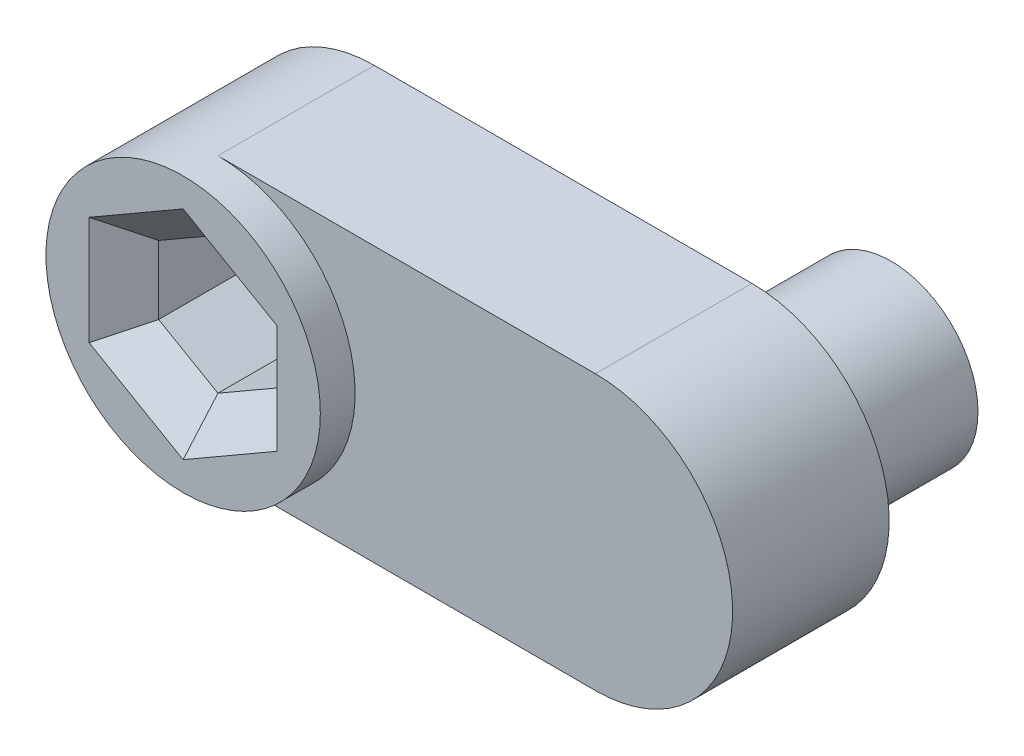
ISO-10303-21;
HEADER;
FILE_DESCRIPTION(('STEP AP214'),'2;1');
FILE_NAME('part.step','',(''),(''),'','','');
FILE_SCHEMA(('AUTOMOTIVE_DESIGN { 1 0 10303 214 1 1 1 1 }'));
ENDSEC;
DATA;
#1=APPLICATION_CONTEXT('core data for automotive mechanical design processes');
#2=APPLICATION_PROTOCOL_DEFINITION('international standard','automotive_design',2000,#1);
#3=PRODUCT_CONTEXT('',#1,'mechanical');
#4=PRODUCT('Part','Part','',(#3));
#5=PRODUCT_RELATED_PRODUCT_CATEGORY('part','',(#4));
#6=PRODUCT_DEFINITION_FORMATION('','',#4);
#7=PRODUCT_DEFINITION_CONTEXT('part definition',#1,'design');
#8=PRODUCT_DEFINITION('design','',#6,#7);
#9=PRODUCT_DEFINITION_SHAPE('','',#8);
#10=(LENGTH_UNIT() NAMED_UNIT(*) SI_UNIT(.MILLI.,.METRE.));
#11=(NAMED_UNIT(*) PLANE_ANGLE_UNIT() SI_UNIT($,.RADIAN.));
#12=(NAMED_UNIT(*) SI_UNIT($,.STERADIAN.) SOLID_ANGLE_UNIT());
#13=UNCERTAINTY_MEASURE_WITH_UNIT(LENGTH_MEASURE(1.E-05),#10,'distance_accuracy_value','');
#14=(GEOMETRIC_REPRESENTATION_CONTEXT(3) GLOBAL_UNCERTAINTY_ASSIGNED_CONTEXT((#13)) GLOBAL_UNIT_ASSIGNED_CONTEXT((#10,
#11,#12)) REPRESENTATION_CONTEXT('',''));
#15=CARTESIAN_POINT('',(0.,0.,0.));
#16=DIRECTION('',(0.,0.,1.));
#17=DIRECTION('',(1.,0.,0.));
#18=AXIS2_PLACEMENT_3D('',#15,#16,#17);
#19=CARTESIAN_POINT('',(-7.44719003610826,-1.96749999999999,-8.));
#20=DIRECTION('',(1.,0.,0.));
#21=DIRECTION('',(0.,1.,0.));
#22=AXIS2_PLACEMENT_3D('',#19,#20,#21);
#23=PLANE('',#22);
#24=DIRECTION('',(0.,0.,1.));
#25=VECTOR('',#24,1.);
#26=CARTESIAN_POINT('',(-7.44719003610826,-1.96749999999999,-8.));
#27=LINE('',#26,#25);
#28=CARTESIAN_POINT('',(-7.44719003610826,-1.96749999999999,2.));
#29=VERTEX_POINT('',#28);
#30=CARTESIAN_POINT('',(-7.44719003610826,-1.96749999999999,8.99999999999999));
#31=VERTEX_POINT('',#30);
#32=EDGE_CURVE('E274',#29,#31,#27,.T.);
#33=ORIENTED_EDGE('',*,*,#32,.T.);
#34=DIRECTION('',(0.,1.,0.));
#35=VECTOR('',#34,1.);
#36=CARTESIAN_POINT('',(-7.44719003610826,1.96749999999998,8.99999999999999));
#37=LINE('',#36,#35);
#38=CARTESIAN_POINT('',(-7.44719003610826,1.96749999999998,8.99999999999999));
#39=VERTEX_POINT('',#38);
#40=EDGE_CURVE('E55',#31,#39,#37,.T.);
#41=ORIENTED_EDGE('',*,*,#40,.T.);
#42=DIRECTION('',(0.,0.,1.));
#43=VECTOR('',#42,1.);
#44=CARTESIAN_POINT('',(-7.44719003610826,1.96749999999998,-8.));
#45=LINE('',#44,#43);
#46=CARTESIAN_POINT('',(-7.44719003610826,1.96749999999998,2.));
#47=VERTEX_POINT('',#46);
#48=EDGE_CURVE('E273',#47,#39,#45,.T.);
#49=ORIENTED_EDGE('',*,*,#48,.F.);
#50=DIRECTION('',(0.,1.,0.));
#51=VECTOR('',#50,1.);
#52=CARTESIAN_POINT('',(-7.44719003610826,-1.96749999999999,2.));
#53=LINE('',#52,#51);
#54=EDGE_CURVE('E271',#29,#47,#53,.T.);
#55=ORIENTED_EDGE('',*,*,#54,.F.);
#56=EDGE_LOOP('',(#33,#41,#49,#55));
#57=FACE_BOUND('',#56,.T.);
#58=ADVANCED_FACE('F45',(#57),#23,.F.);
#59=CARTESIAN_POINT('',(-10.855,-3.93499999999998,-8.));
#60=DIRECTION('',(0.5,-0.866025403784439,0.));
#61=DIRECTION('',(0.866025403784439,0.5,0.));
#62=AXIS2_PLACEMENT_3D('',#59,#60,#61);
#63=PLANE('',#62);
#64=DIRECTION('',(0.,0.,1.));
#65=VECTOR('',#64,1.);
#66=CARTESIAN_POINT('',(-10.855,-3.93499999999998,-8.));
#67=LINE('',#66,#65);
#68=CARTESIAN_POINT('',(-10.855,-3.93499999999998,2.));
#69=VERTEX_POINT('',#68);
#70=CARTESIAN_POINT('',(-10.855,-3.93499999999998,8.99999999999999));
#71=VERTEX_POINT('',#70);
#72=EDGE_CURVE('E277',#69,#71,#67,.T.);
#73=ORIENTED_EDGE('',*,*,#72,.T.);
#74=DIRECTION('',(0.866025403784439,0.5,0.));
#75=VECTOR('',#74,1.);
#76=CARTESIAN_POINT('',(-7.44719003610826,-1.96749999999999,8.99999999999999));
#77=LINE('',#76,#75);
#78=EDGE_CURVE('E70',#71,#31,#77,.T.);
#79=ORIENTED_EDGE('',*,*,#78,.T.);
#80=ORIENTED_EDGE('',*,*,#32,.F.);
#81=DIRECTION('',(0.866025403784439,0.5,0.));
#82=VECTOR('',#81,1.);
#83=CARTESIAN_POINT('',(-10.855,-3.93499999999998,2.));
#84=LINE('',#83,#82);
#85=EDGE_CURVE('E269',#69,#29,#84,.T.);
#86=ORIENTED_EDGE('',*,*,#85,.F.);
#87=EDGE_LOOP('',(#73,#79,#80,#86));
#88=FACE_BOUND('',#87,.T.);
#89=ADVANCED_FACE('F363',(#88),#63,.F.);
#90=CARTESIAN_POINT('',(-14.2628099638917,-1.96749999999999,-8.));
#91=DIRECTION('',(-0.5,-0.866025403784439,0.));
#92=DIRECTION('',(0.866025403784439,-0.5,0.));
#93=AXIS2_PLACEMENT_3D('',#90,#91,#92);
#94=PLANE('',#93);
#95=DIRECTION('',(0.,0.,1.));
#96=VECTOR('',#95,1.);
#97=CARTESIAN_POINT('',(-14.2628099638917,-1.96749999999999,-8.));
#98=LINE('',#97,#96);
#99=CARTESIAN_POINT('',(-14.2628099638917,-1.96749999999999,2.));
#100=VERTEX_POINT('',#99);
#101=CARTESIAN_POINT('',(-14.2628099638917,-1.96749999999999,8.99999999999999));
#102=VERTEX_POINT('',#101);
#103=EDGE_CURVE('E279',#100,#102,#98,.T.);
#104=ORIENTED_EDGE('',*,*,#103,.T.);
#105=DIRECTION('',(0.866025403784439,-0.5,0.));
#106=VECTOR('',#105,1.);
#107=CARTESIAN_POINT('',(-10.855,-3.93499999999998,8.99999999999998));
#108=LINE('',#107,#106);
#109=EDGE_CURVE('E323',#102,#71,#108,.T.);
#110=ORIENTED_EDGE('',*,*,#109,.T.);
#111=ORIENTED_EDGE('',*,*,#72,.F.);
#112=DIRECTION('',(0.866025403784439,-0.5,0.));
#113=VECTOR('',#112,1.);
#114=CARTESIAN_POINT('',(-14.2628099638917,-1.96749999999999,2.));
#115=LINE('',#114,#113);
#116=EDGE_CURVE('E267',#100,#69,#115,.T.);
#117=ORIENTED_EDGE('',*,*,#116,.F.);
#118=EDGE_LOOP('',(#104,#110,#111,#117));
#119=FACE_BOUND('',#118,.T.);
#120=ADVANCED_FACE('F369',(#119),#94,.F.);
#121=CARTESIAN_POINT('',(-14.2628099638917,1.96749999999998,-8.));
#122=DIRECTION('',(-1.,0.,0.));
#123=DIRECTION('',(0.,-1.,0.));
#124=AXIS2_PLACEMENT_3D('',#121,#122,#123);
#125=PLANE('',#124);
#126=DIRECTION('',(0.,0.,1.));
#127=VECTOR('',#126,1.);
#128=CARTESIAN_POINT('',(-14.2628099638917,1.96749999999998,-8.));
#129=LINE('',#128,#127);
#130=CARTESIAN_POINT('',(-14.2628099638917,1.96749999999998,2.));
#131=VERTEX_POINT('',#130);
#132=CARTESIAN_POINT('',(-14.2628099638917,1.96749999999998,8.99999999999999));
#133=VERTEX_POINT('',#132);
#134=EDGE_CURVE('E282',#131,#133,#129,.T.);
#135=ORIENTED_EDGE('',*,*,#134,.T.);
#136=DIRECTION('',(0.,-1.,0.));
#137=VECTOR('',#136,1.);
#138=CARTESIAN_POINT('',(-14.2628099638917,-1.96749999999999,8.99999999999999));
#139=LINE('',#138,#137);
#140=EDGE_CURVE('E321',#133,#102,#139,.T.);
#141=ORIENTED_EDGE('',*,*,#140,.T.);
#142=ORIENTED_EDGE('',*,*,#103,.F.);
#143=DIRECTION('',(0.,-1.,0.));
#144=VECTOR('',#143,1.);
#145=CARTESIAN_POINT('',(-14.2628099638917,1.96749999999998,2.));
#146=LINE('',#145,#144);
#147=EDGE_CURVE('E265',#131,#100,#146,.T.);
#148=ORIENTED_EDGE('',*,*,#147,.F.);
#149=EDGE_LOOP('',(#135,#141,#142,#148));
#150=FACE_BOUND('',#149,.T.);
#151=ADVANCED_FACE('F468',(#150),#125,.F.);
#152=CARTESIAN_POINT('',(-10.855,3.93499999999997,-8.));
#153=DIRECTION('',(-0.5,0.866025403784439,0.));
#154=DIRECTION('',(-0.866025403784439,-0.5,0.));
#155=AXIS2_PLACEMENT_3D('',#152,#153,#154);
#156=PLANE('',#155);
#157=DIRECTION('',(0.,0.,1.));
#158=VECTOR('',#157,1.);
#159=CARTESIAN_POINT('',(-10.855,3.93499999999997,-8.));
#160=LINE('',#159,#158);
#161=CARTESIAN_POINT('',(-10.855,3.93499999999997,2.));
#162=VERTEX_POINT('',#161);
#163=CARTESIAN_POINT('',(-10.855,3.93499999999997,8.99999999999999));
#164=VERTEX_POINT('',#163);
#165=EDGE_CURVE('E285',#162,#164,#160,.T.);
#166=ORIENTED_EDGE('',*,*,#165,.T.);
#167=DIRECTION('',(-0.866025403784439,-0.5,0.));
#168=VECTOR('',#167,1.);
#169=CARTESIAN_POINT('',(-14.2628099638917,1.96749999999998,8.99999999999999));
#170=LINE('',#169,#168);
#171=EDGE_CURVE('E318',#164,#133,#170,.T.);
#172=ORIENTED_EDGE('',*,*,#171,.T.);
#173=ORIENTED_EDGE('',*,*,#134,.F.);
#174=DIRECTION('',(-0.866025403784439,-0.5,0.));
#175=VECTOR('',#174,1.);
#176=CARTESIAN_POINT('',(-10.855,3.93499999999997,2.));
#177=LINE('',#176,#175);
#178=EDGE_CURVE('E253',#162,#131,#177,.T.);
#179=ORIENTED_EDGE('',*,*,#178,.F.);
#180=EDGE_LOOP('',(#166,#172,#173,#179));
#181=FACE_BOUND('',#180,.T.);
#182=ADVANCED_FACE('F406',(#181),#156,.F.);
#183=CARTESIAN_POINT('',(-7.44719003610826,1.96749999999998,-8.));
#184=DIRECTION('',(0.5,0.866025403784439,0.));
#185=DIRECTION('',(-0.866025403784439,0.5,0.));
#186=AXIS2_PLACEMENT_3D('',#183,#184,#185);
#187=PLANE('',#186);
#188=ORIENTED_EDGE('',*,*,#48,.T.);
#189=DIRECTION('',(-0.866025403784439,0.5,0.));
#190=VECTOR('',#189,1.);
#191=CARTESIAN_POINT('',(-10.855,3.93499999999997,8.99999999999999));
#192=LINE('',#191,#190);
#193=EDGE_CURVE('E11',#39,#164,#192,.T.);
#194=ORIENTED_EDGE('',*,*,#193,.T.);
#195=ORIENTED_EDGE('',*,*,#165,.F.);
#196=DIRECTION('',(-0.866025403784439,0.5,0.));
#197=VECTOR('',#196,1.);
#198=CARTESIAN_POINT('',(-7.44719003610826,1.96749999999998,2.));
#199=LINE('',#198,#197);
#200=EDGE_CURVE('E206',#47,#162,#199,.T.);
#201=ORIENTED_EDGE('',*,*,#200,.F.);
#202=EDGE_LOOP('',(#188,#194,#195,#201));
#203=FACE_BOUND('',#202,.T.);
#204=ADVANCED_FACE('F373',(#203),#187,.F.);
#205=CARTESIAN_POINT('',(10.855,0.,9.));
#206=DIRECTION('',(0.,0.,-1.));
#207=DIRECTION('',(-1.,0.,0.));
#208=AXIS2_PLACEMENT_3D('',#205,#206,#207);
#209=CYLINDRICAL_SURFACE('',#208,7.89);
#210=CARTESIAN_POINT('',(10.855,0.,0.));
#211=DIRECTION('',(0.,0.,1.));
#212=DIRECTION('',(1.,0.,0.));
#213=AXIS2_PLACEMENT_3D('',#210,#211,#212);
#214=CIRCLE('',#213,7.89);
#215=CARTESIAN_POINT('',(10.855,-7.89,0.));
#216=VERTEX_POINT('',#215);
#217=CARTESIAN_POINT('',(10.855,7.89,0.));
#218=VERTEX_POINT('',#217);
#219=EDGE_CURVE('E291',#216,#218,#214,.T.);
#220=ORIENTED_EDGE('',*,*,#219,.T.);
#221=DIRECTION('',(0.,0.,-1.));
#222=VECTOR('',#221,1.);
#223=CARTESIAN_POINT('',(10.855,7.89,9.));
#224=LINE('',#223,#222);
#225=CARTESIAN_POINT('',(10.855,7.89,9.));
#226=VERTEX_POINT('',#225);
#227=EDGE_CURVE('E189',#226,#218,#224,.T.);
#228=ORIENTED_EDGE('',*,*,#227,.F.);
#229=CARTESIAN_POINT('',(10.855,0.,9.));
#230=DIRECTION('',(0.,0.,1.));
#231=DIRECTION('',(1.,0.,0.));
#232=AXIS2_PLACEMENT_3D('',#229,#230,#231);
#233=CIRCLE('',#232,7.89);
#234=CARTESIAN_POINT('',(10.855,-7.89,9.));
#235=VERTEX_POINT('',#234);
#236=EDGE_CURVE('E197',#235,#226,#233,.T.);
#237=ORIENTED_EDGE('',*,*,#236,.F.);
#238=DIRECTION('',(0.,0.,-1.));
#239=VECTOR('',#238,1.);
#240=CARTESIAN_POINT('',(10.855,-7.89,9.));
#241=LINE('',#240,#239);
#242=EDGE_CURVE('E295',#235,#216,#241,.T.);
#243=ORIENTED_EDGE('',*,*,#242,.T.);
#244=EDGE_LOOP('',(#220,#228,#237,#243));
#245=FACE_BOUND('',#244,.T.);
#246=ADVANCED_FACE('F360',(#245),#209,.T.);
#247=CARTESIAN_POINT('',(10.855,7.89,9.));
#248=DIRECTION('',(0.,-1.,0.));
#249=DIRECTION('',(1.,0.,0.));
#250=AXIS2_PLACEMENT_3D('',#247,#248,#249);
#251=PLANE('',#250);
#252=DIRECTION('',(-1.,0.,0.));
#253=VECTOR('',#252,1.);
#254=CARTESIAN_POINT('',(10.855,7.89,0.));
#255=LINE('',#254,#253);
#256=CARTESIAN_POINT('',(-10.855,7.89,0.));
#257=VERTEX_POINT('',#256);
#258=EDGE_CURVE('E185',#218,#257,#255,.T.);
#259=ORIENTED_EDGE('',*,*,#258,.T.);
#260=DIRECTION('',(0.,0.,-1.));
#261=VECTOR('',#260,1.);
#262=CARTESIAN_POINT('',(-10.855,7.89,9.));
#263=LINE('',#262,#261);
#264=CARTESIAN_POINT('',(-10.855,7.89,9.));
#265=VERTEX_POINT('',#264);
#266=EDGE_CURVE('E179',#265,#257,#263,.T.);
#267=ORIENTED_EDGE('',*,*,#266,.F.);
#268=DIRECTION('',(-1.,0.,0.));
#269=VECTOR('',#268,1.);
#270=CARTESIAN_POINT('',(10.855,7.89,9.));
#271=LINE('',#270,#269);
#272=EDGE_CURVE('E183',#226,#265,#271,.T.);
#273=ORIENTED_EDGE('',*,*,#272,.F.);
#274=ORIENTED_EDGE('',*,*,#227,.T.);
#275=EDGE_LOOP('',(#259,#267,#273,#274));
#276=FACE_BOUND('',#275,.T.);
#277=ADVANCED_FACE('F181',(#276),#251,.F.);
#278=CARTESIAN_POINT('',(-10.855,0.,9.));
#279=DIRECTION('',(0.,0.,-1.));
#280=DIRECTION('',(-1.,0.,0.));
#281=AXIS2_PLACEMENT_3D('',#278,#279,#280);
#282=CYLINDRICAL_SURFACE('',#281,7.89);
#283=CARTESIAN_POINT('',(-10.855,0.,0.));
#284=DIRECTION('',(0.,0.,1.));
#285=DIRECTION('',(1.,0.,0.));
#286=AXIS2_PLACEMENT_3D('',#283,#284,#285);
#287=CIRCLE('',#286,7.89);
#288=CARTESIAN_POINT('',(-10.855,-7.89,0.));
#289=VERTEX_POINT('',#288);
#290=EDGE_CURVE('E299',#257,#289,#287,.T.);
#291=ORIENTED_EDGE('',*,*,#290,.T.);
#292=DIRECTION('',(0.,0.,-1.));
#293=VECTOR('',#292,1.);
#294=CARTESIAN_POINT('',(-10.855,-7.89,9.));
#295=LINE('',#294,#293);
#296=CARTESIAN_POINT('',(-10.855,-7.89,9.));
#297=VERTEX_POINT('',#296);
#298=EDGE_CURVE('E190',#297,#289,#295,.T.);
#299=ORIENTED_EDGE('',*,*,#298,.F.);
#300=CARTESIAN_POINT('',(-10.855,0.,9.));
#301=DIRECTION('',(0.,0.,1.));
#302=DIRECTION('',(1.,0.,0.));
#303=AXIS2_PLACEMENT_3D('',#300,#301,#302);
#304=CIRCLE('',#303,7.89);
#305=EDGE_CURVE('E194',#297,#265,#304,.T.);
#306=ORIENTED_EDGE('',*,*,#305,.T.);
#307=ORIENTED_EDGE('',*,*,#266,.T.);
#308=EDGE_LOOP('',(#291,#299,#306,#307));
#309=FACE_BOUND('',#308,.T.);
#310=CARTESIAN_POINT('',(-10.855,0.,11.));
#311=DIRECTION('',(0.,0.,1.));
#312=DIRECTION('',(1.,0.,0.));
#313=AXIS2_PLACEMENT_3D('',#310,#311,#312);
#314=CIRCLE('',#313,7.89);
#315=CARTESIAN_POINT('',(-2.965,0.,11.));
#316=VERTEX_POINT('',#315);
#317=EDGE_CURVE('E214',#316,#316,#314,.T.);
#318=ORIENTED_EDGE('',*,*,#317,.F.);
#319=EDGE_LOOP('',(#318));
#320=FACE_BOUND('',#319,.T.);
#321=ADVANCED_FACE('F201',(#309,#320),#282,.T.);
#322=CARTESIAN_POINT('',(10.855,-7.89,9.));
#323=DIRECTION('',(0.,1.,0.));
#324=DIRECTION('',(-1.,0.,0.));
#325=AXIS2_PLACEMENT_3D('',#322,#323,#324);
#326=PLANE('',#325);
#327=DIRECTION('',(1.,0.,0.));
#328=VECTOR('',#327,1.);
#329=CARTESIAN_POINT('',(10.855,-7.89,0.));
#330=LINE('',#329,#328);
#331=EDGE_CURVE('E292',#289,#216,#330,.T.);
#332=ORIENTED_EDGE('',*,*,#331,.T.);
#333=ORIENTED_EDGE('',*,*,#242,.F.);
#334=DIRECTION('',(1.,0.,0.));
#335=VECTOR('',#334,1.);
#336=CARTESIAN_POINT('',(10.855,-7.89,9.));
#337=LINE('',#336,#335);
#338=EDGE_CURVE('E199',#297,#235,#337,.T.);
#339=ORIENTED_EDGE('',*,*,#338,.F.);
#340=ORIENTED_EDGE('',*,*,#298,.T.);
#341=EDGE_LOOP('',(#332,#333,#339,#340));
#342=FACE_BOUND('',#341,.T.);
#343=ADVANCED_FACE('F351',(#342),#326,.F.);
#344=CARTESIAN_POINT('',(10.855,0.,9.));
#345=DIRECTION('',(0.,0.,1.));
#346=DIRECTION('',(1.,0.,0.));
#347=AXIS2_PLACEMENT_3D('',#344,#345,#346);
#348=PLANE('',#347);
#349=ORIENTED_EDGE('',*,*,#305,.F.);
#350=ORIENTED_EDGE('',*,*,#338,.T.);
#351=ORIENTED_EDGE('',*,*,#236,.T.);
#352=ORIENTED_EDGE('',*,*,#272,.T.);
#353=EDGE_LOOP('',(#349,#350,#351,#352));
#354=FACE_BOUND('',#353,.T.);
#355=ADVANCED_FACE('F193',(#354),#348,.T.);
#356=CARTESIAN_POINT('',(10.855,0.,0.));
#357=DIRECTION('',(0.,0.,1.));
#358=DIRECTION('',(1.,0.,0.));
#359=AXIS2_PLACEMENT_3D('',#356,#357,#358);
#360=PLANE('',#359);
#361=DIRECTION('',(0.,-1.,0.));
#362=VECTOR('',#361,1.);
#363=CARTESIAN_POINT('',(-5.44719003610826,3.12220053837923,0.));
#364=LINE('',#363,#362);
#365=CARTESIAN_POINT('',(-5.44719003610826,3.12220053837923,0.));
#366=VERTEX_POINT('',#365);
#367=CARTESIAN_POINT('',(-5.44719003610826,-3.12220053837924,0.));
#368=VERTEX_POINT('',#367);
#369=EDGE_CURVE('E237',#366,#368,#364,.T.);
#370=ORIENTED_EDGE('',*,*,#369,.F.);
#371=DIRECTION('',(0.866025403784439,-0.5,0.));
#372=VECTOR('',#371,1.);
#373=CARTESIAN_POINT('',(-10.855,6.24440107675847,0.));
#374=LINE('',#373,#372);
#375=CARTESIAN_POINT('',(-10.855,6.24440107675847,0.));
#376=VERTEX_POINT('',#375);
#377=EDGE_CURVE('E235',#376,#366,#374,.T.);
#378=ORIENTED_EDGE('',*,*,#377,.F.);
#379=DIRECTION('',(0.866025403784439,0.5,0.));
#380=VECTOR('',#379,1.);
#381=CARTESIAN_POINT('',(-16.2628099638917,3.12220053837923,0.));
#382=LINE('',#381,#380);
#383=CARTESIAN_POINT('',(-16.2628099638917,3.12220053837923,0.));
#384=VERTEX_POINT('',#383);
#385=EDGE_CURVE('E219',#384,#376,#382,.T.);
#386=ORIENTED_EDGE('',*,*,#385,.F.);
#387=DIRECTION('',(0.,1.,0.));
#388=VECTOR('',#387,1.);
#389=CARTESIAN_POINT('',(-16.2628099638917,-3.12220053837924,0.));
#390=LINE('',#389,#388);
#391=CARTESIAN_POINT('',(-16.2628099638917,-3.12220053837924,0.));
#392=VERTEX_POINT('',#391);
#393=EDGE_CURVE('E246',#392,#384,#390,.T.);
#394=ORIENTED_EDGE('',*,*,#393,.F.);
#395=DIRECTION('',(-0.866025403784439,0.5,0.));
#396=VECTOR('',#395,1.);
#397=CARTESIAN_POINT('',(-10.855,-6.24440107675848,0.));
#398=LINE('',#397,#396);
#399=CARTESIAN_POINT('',(-10.855,-6.24440107675848,0.));
#400=VERTEX_POINT('',#399);
#401=EDGE_CURVE('E243',#400,#392,#398,.T.);
#402=ORIENTED_EDGE('',*,*,#401,.F.);
#403=DIRECTION('',(-0.866025403784438,-0.5,0.));
#404=VECTOR('',#403,1.);
#405=CARTESIAN_POINT('',(-5.44719003610826,-3.12220053837924,0.));
#406=LINE('',#405,#404);
#407=EDGE_CURVE('E240',#368,#400,#406,.T.);
#408=ORIENTED_EDGE('',*,*,#407,.F.);
#409=EDGE_LOOP('',(#370,#378,#386,#394,#402,#408));
#410=FACE_BOUND('',#409,.T.);
#411=CARTESIAN_POINT('',(10.855,0.,0.));
#412=DIRECTION('',(0.,0.,1.));
#413=DIRECTION('',(1.,0.,0.));
#414=AXIS2_PLACEMENT_3D('',#411,#412,#413);
#415=CIRCLE('',#414,5.);
#416=CARTESIAN_POINT('',(15.855,0.,0.));
#417=VERTEX_POINT('',#416);
#418=EDGE_CURVE('E210',#417,#417,#415,.F.);
#419=ORIENTED_EDGE('',*,*,#418,.F.);
#420=EDGE_LOOP('',(#419));
#421=FACE_BOUND('',#420,.T.);
#422=ORIENTED_EDGE('',*,*,#219,.F.);
#423=ORIENTED_EDGE('',*,*,#331,.F.);
#424=ORIENTED_EDGE('',*,*,#290,.F.);
#425=ORIENTED_EDGE('',*,*,#258,.F.);
#426=EDGE_LOOP('',(#422,#423,#424,#425));
#427=FACE_BOUND('',#426,.T.);
#428=ADVANCED_FACE('F383',(#410,#421,#427),#360,.F.);
#429=CARTESIAN_POINT('',(10.855,0.,-8.));
#430=DIRECTION('',(0.,0.,1.));
#431=DIRECTION('',(1.,0.,0.));
#432=AXIS2_PLACEMENT_3D('',#429,#430,#431);
#433=CYLINDRICAL_SURFACE('',#432,5.);
#434=CARTESIAN_POINT('',(10.855,0.,-8.));
#435=DIRECTION('',(0.,0.,-1.));
#436=DIRECTION('',(-1.,0.,0.));
#437=AXIS2_PLACEMENT_3D('',#434,#435,#436);
#438=CIRCLE('',#437,5.);
#439=CARTESIAN_POINT('',(5.855,0.,-8.));
#440=VERTEX_POINT('',#439);
#441=EDGE_CURVE('E276',#440,#440,#438,.T.);
#442=ORIENTED_EDGE('',*,*,#441,.F.);
#443=EDGE_LOOP('',(#442));
#444=FACE_BOUND('',#443,.T.);
#445=ORIENTED_EDGE('',*,*,#418,.T.);
#446=EDGE_LOOP('',(#445));
#447=FACE_BOUND('',#446,.T.);
#448=ADVANCED_FACE('F379',(#444,#447),#433,.T.);
#449=CARTESIAN_POINT('',(10.855,0.,-8.));
#450=DIRECTION('',(0.,0.,-1.));
#451=DIRECTION('',(-1.,0.,0.));
#452=AXIS2_PLACEMENT_3D('',#449,#450,#451);
#453=PLANE('',#452);
#454=ORIENTED_EDGE('',*,*,#441,.T.);
#455=EDGE_LOOP('',(#454));
#456=FACE_BOUND('',#455,.T.);
#457=ADVANCED_FACE('F375',(#456),#453,.T.);
#458=CARTESIAN_POINT('',(0.,0.,2.));
#459=DIRECTION('',(0.,0.,-1.));
#460=DIRECTION('',(-1.,0.,0.));
#461=AXIS2_PLACEMENT_3D('',#458,#459,#460);
#462=PLANE('',#461);
#463=DIRECTION('',(0.866025403784439,-0.5,0.));
#464=VECTOR('',#463,1.);
#465=CARTESIAN_POINT('',(-10.855,6.24440107675847,2.));
#466=LINE('',#465,#464);
#467=CARTESIAN_POINT('',(-10.855,6.24440107675847,2.));
#468=VERTEX_POINT('',#467);
#469=CARTESIAN_POINT('',(-5.44719003610826,3.12220053837923,2.));
#470=VERTEX_POINT('',#469);
#471=EDGE_CURVE('E215',#468,#470,#466,.T.);
#472=ORIENTED_EDGE('',*,*,#471,.T.);
#473=DIRECTION('',(0.,-1.,0.));
#474=VECTOR('',#473,1.);
#475=CARTESIAN_POINT('',(-5.44719003610826,3.12220053837923,2.));
#476=LINE('',#475,#474);
#477=CARTESIAN_POINT('',(-5.44719003610826,-3.12220053837924,2.));
#478=VERTEX_POINT('',#477);
#479=EDGE_CURVE('E218',#470,#478,#476,.T.);
#480=ORIENTED_EDGE('',*,*,#479,.T.);
#481=DIRECTION('',(-0.866025403784438,-0.5,0.));
#482=VECTOR('',#481,1.);
#483=CARTESIAN_POINT('',(-5.44719003610826,-3.12220053837924,2.));
#484=LINE('',#483,#482);
#485=CARTESIAN_POINT('',(-10.855,-6.24440107675848,2.));
#486=VERTEX_POINT('',#485);
#487=EDGE_CURVE('E222',#478,#486,#484,.T.);
#488=ORIENTED_EDGE('',*,*,#487,.T.);
#489=DIRECTION('',(-0.866025403784439,0.5,0.));
#490=VECTOR('',#489,1.);
#491=CARTESIAN_POINT('',(-10.855,-6.24440107675848,2.));
#492=LINE('',#491,#490);
#493=CARTESIAN_POINT('',(-16.2628099638917,-3.12220053837924,2.));
#494=VERTEX_POINT('',#493);
#495=EDGE_CURVE('E225',#486,#494,#492,.T.);
#496=ORIENTED_EDGE('',*,*,#495,.T.);
#497=DIRECTION('',(0.,1.,0.));
#498=VECTOR('',#497,1.);
#499=CARTESIAN_POINT('',(-16.2628099638917,-3.12220053837924,2.));
#500=LINE('',#499,#498);
#501=CARTESIAN_POINT('',(-16.2628099638917,3.12220053837923,2.));
#502=VERTEX_POINT('',#501);
#503=EDGE_CURVE('E228',#494,#502,#500,.T.);
#504=ORIENTED_EDGE('',*,*,#503,.T.);
#505=DIRECTION('',(0.866025403784439,0.5,0.));
#506=VECTOR('',#505,1.);
#507=CARTESIAN_POINT('',(-16.2628099638917,3.12220053837923,2.));
#508=LINE('',#507,#506);
#509=EDGE_CURVE('E231',#502,#468,#508,.T.);
#510=ORIENTED_EDGE('',*,*,#509,.T.);
#511=EDGE_LOOP('',(#472,#480,#488,#496,#504,#510));
#512=FACE_BOUND('',#511,.T.);
#513=ORIENTED_EDGE('',*,*,#54,.T.);
#514=ORIENTED_EDGE('',*,*,#200,.T.);
#515=ORIENTED_EDGE('',*,*,#178,.T.);
#516=ORIENTED_EDGE('',*,*,#147,.T.);
#517=ORIENTED_EDGE('',*,*,#116,.T.);
#518=ORIENTED_EDGE('',*,*,#85,.T.);
#519=EDGE_LOOP('',(#513,#514,#515,#516,#517,#518));
#520=FACE_BOUND('',#519,.T.);
#521=ADVANCED_FACE('F378',(#512,#520),#462,.T.);
#522=CARTESIAN_POINT('',(-10.855,6.24440107675847,2.));
#523=DIRECTION('',(0.5,0.866025403784439,0.));
#524=DIRECTION('',(-0.866025403784439,0.5,0.));
#525=AXIS2_PLACEMENT_3D('',#522,#523,#524);
#526=PLANE('',#525);
#527=ORIENTED_EDGE('',*,*,#377,.T.);
#528=DIRECTION('',(0.,0.,-1.));
#529=VECTOR('',#528,1.);
#530=CARTESIAN_POINT('',(-5.44719003610826,3.12220053837923,2.));
#531=LINE('',#530,#529);
#532=EDGE_CURVE('E234',#470,#366,#531,.T.);
#533=ORIENTED_EDGE('',*,*,#532,.F.);
#534=ORIENTED_EDGE('',*,*,#471,.F.);
#535=DIRECTION('',(0.,0.,-1.));
#536=VECTOR('',#535,1.);
#537=CARTESIAN_POINT('',(-10.855,6.24440107675847,2.));
#538=LINE('',#537,#536);
#539=EDGE_CURVE('E251',#468,#376,#538,.T.);
#540=ORIENTED_EDGE('',*,*,#539,.T.);
#541=EDGE_LOOP('',(#527,#533,#534,#540));
#542=FACE_BOUND('',#541,.T.);
#543=ADVANCED_FACE('F476',(#542),#526,.F.);
#544=CARTESIAN_POINT('',(-16.2628099638917,3.12220053837923,2.));
#545=DIRECTION('',(-0.5,0.866025403784439,0.));
#546=DIRECTION('',(-0.866025403784439,-0.5,0.));
#547=AXIS2_PLACEMENT_3D('',#544,#545,#546);
#548=PLANE('',#547);
#549=ORIENTED_EDGE('',*,*,#385,.T.);
#550=ORIENTED_EDGE('',*,*,#539,.F.);
#551=ORIENTED_EDGE('',*,*,#509,.F.);
#552=DIRECTION('',(0.,0.,-1.));
#553=VECTOR('',#552,1.);
#554=CARTESIAN_POINT('',(-16.2628099638917,3.12220053837923,2.));
#555=LINE('',#554,#553);
#556=EDGE_CURVE('E254',#502,#384,#555,.T.);
#557=ORIENTED_EDGE('',*,*,#556,.T.);
#558=EDGE_LOOP('',(#549,#550,#551,#557));
#559=FACE_BOUND('',#558,.T.);
#560=ADVANCED_FACE('F482',(#559),#548,.F.);
#561=CARTESIAN_POINT('',(-16.2628099638917,-3.12220053837924,2.));
#562=DIRECTION('',(-1.,0.,0.));
#563=DIRECTION('',(0.,-1.,0.));
#564=AXIS2_PLACEMENT_3D('',#561,#562,#563);
#565=PLANE('',#564);
#566=ORIENTED_EDGE('',*,*,#393,.T.);
#567=ORIENTED_EDGE('',*,*,#556,.F.);
#568=ORIENTED_EDGE('',*,*,#503,.F.);
#569=DIRECTION('',(0.,0.,-1.));
#570=VECTOR('',#569,1.);
#571=CARTESIAN_POINT('',(-16.2628099638917,-3.12220053837924,2.));
#572=LINE('',#571,#570);
#573=EDGE_CURVE('E256',#494,#392,#572,.T.);
#574=ORIENTED_EDGE('',*,*,#573,.T.);
#575=EDGE_LOOP('',(#566,#567,#568,#574));
#576=FACE_BOUND('',#575,.T.);
#577=ADVANCED_FACE('F488',(#576),#565,.F.);
#578=CARTESIAN_POINT('',(-10.855,-6.24440107675848,2.));
#579=DIRECTION('',(-0.5,-0.866025403784439,0.));
#580=DIRECTION('',(0.866025403784439,-0.5,0.));
#581=AXIS2_PLACEMENT_3D('',#578,#579,#580);
#582=PLANE('',#581);
#583=ORIENTED_EDGE('',*,*,#401,.T.);
#584=ORIENTED_EDGE('',*,*,#573,.F.);
#585=ORIENTED_EDGE('',*,*,#495,.F.);
#586=DIRECTION('',(0.,0.,-1.));
#587=VECTOR('',#586,1.);
#588=CARTESIAN_POINT('',(-10.855,-6.24440107675848,2.));
#589=LINE('',#588,#587);
#590=EDGE_CURVE('E258',#486,#400,#589,.T.);
#591=ORIENTED_EDGE('',*,*,#590,.T.);
#592=EDGE_LOOP('',(#583,#584,#585,#591));
#593=FACE_BOUND('',#592,.T.);
#594=ADVANCED_FACE('F492',(#593),#582,.F.);
#595=CARTESIAN_POINT('',(-5.44719003610826,-3.12220053837924,2.));
#596=DIRECTION('',(0.5,-0.866025403784439,0.));
#597=DIRECTION('',(0.866025403784439,0.5,0.));
#598=AXIS2_PLACEMENT_3D('',#595,#596,#597);
#599=PLANE('',#598);
#600=ORIENTED_EDGE('',*,*,#407,.T.);
#601=ORIENTED_EDGE('',*,*,#590,.F.);
#602=ORIENTED_EDGE('',*,*,#487,.F.);
#603=DIRECTION('',(0.,0.,-1.));
#604=VECTOR('',#603,1.);
#605=CARTESIAN_POINT('',(-5.44719003610826,-3.12220053837924,2.));
#606=LINE('',#605,#604);
#607=EDGE_CURVE('E260',#478,#368,#606,.T.);
#608=ORIENTED_EDGE('',*,*,#607,.T.);
#609=EDGE_LOOP('',(#600,#601,#602,#608));
#610=FACE_BOUND('',#609,.T.);
#611=ADVANCED_FACE('F496',(#610),#599,.F.);
#612=CARTESIAN_POINT('',(-5.44719003610826,3.12220053837923,2.));
#613=DIRECTION('',(1.,0.,0.));
#614=DIRECTION('',(0.,1.,0.));
#615=AXIS2_PLACEMENT_3D('',#612,#613,#614);
#616=PLANE('',#615);
#617=ORIENTED_EDGE('',*,*,#369,.T.);
#618=ORIENTED_EDGE('',*,*,#607,.F.);
#619=ORIENTED_EDGE('',*,*,#479,.F.);
#620=ORIENTED_EDGE('',*,*,#532,.T.);
#621=EDGE_LOOP('',(#617,#618,#619,#620));
#622=FACE_BOUND('',#621,.T.);
#623=ADVANCED_FACE('F447',(#622),#616,.F.);
#624=CARTESIAN_POINT('',(0.,0.,11.));
#625=DIRECTION('',(0.,0.,1.));
#626=DIRECTION('',(1.,0.,0.));
#627=AXIS2_PLACEMENT_3D('',#624,#625,#626);
#628=PLANE('',#627);
#629=DIRECTION('',(0.,1.,0.));
#630=VECTOR('',#629,1.);
#631=CARTESIAN_POINT('',(-16.2628099638917,1.96749999999998,11.));
#632=LINE('',#631,#630);
#633=CARTESIAN_POINT('',(-16.2628099638917,-3.12220053837925,11.));
#634=VERTEX_POINT('',#633);
#635=CARTESIAN_POINT('',(-16.2628099638917,3.12220053837924,11.));
#636=VERTEX_POINT('',#635);
#637=EDGE_CURVE('E313',#634,#636,#632,.T.);
#638=ORIENTED_EDGE('',*,*,#637,.T.);
#639=DIRECTION('',(0.866025403784439,0.5,0.));
#640=VECTOR('',#639,1.);
#641=CARTESIAN_POINT('',(-11.855,5.66705080756885,11.));
#642=LINE('',#641,#640);
#643=CARTESIAN_POINT('',(-10.855,6.24440107675847,11.));
#644=VERTEX_POINT('',#643);
#645=EDGE_CURVE('E315',#636,#644,#642,.T.);
#646=ORIENTED_EDGE('',*,*,#645,.T.);
#647=DIRECTION('',(0.866025403784439,-0.5,0.));
#648=VECTOR('',#647,1.);
#649=CARTESIAN_POINT('',(-6.44719003610826,3.69955080756886,11.));
#650=LINE('',#649,#648);
#651=CARTESIAN_POINT('',(-5.44719003610826,3.12220053837923,11.));
#652=VERTEX_POINT('',#651);
#653=EDGE_CURVE('E205',#644,#652,#650,.T.);
#654=ORIENTED_EDGE('',*,*,#653,.T.);
#655=DIRECTION('',(0.,-1.,0.));
#656=VECTOR('',#655,1.);
#657=CARTESIAN_POINT('',(-5.44719003610826,-1.96749999999999,11.));
#658=LINE('',#657,#656);
#659=CARTESIAN_POINT('',(-5.44719003610826,-3.12220053837924,11.));
#660=VERTEX_POINT('',#659);
#661=EDGE_CURVE('E208',#652,#660,#658,.T.);
#662=ORIENTED_EDGE('',*,*,#661,.T.);
#663=DIRECTION('',(-0.866025403784439,-0.5,0.));
#664=VECTOR('',#663,1.);
#665=CARTESIAN_POINT('',(-9.855,-5.66705080756885,11.));
#666=LINE('',#665,#664);
#667=CARTESIAN_POINT('',(-10.855,-6.24440107675848,11.));
#668=VERTEX_POINT('',#667);
#669=EDGE_CURVE('E309',#660,#668,#666,.T.);
#670=ORIENTED_EDGE('',*,*,#669,.T.);
#671=DIRECTION('',(-0.866025403784439,0.5,0.));
#672=VECTOR('',#671,1.);
#673=CARTESIAN_POINT('',(-15.2628099638917,-3.69955080756887,11.));
#674=LINE('',#673,#672);
#675=EDGE_CURVE('E311',#668,#634,#674,.T.);
#676=ORIENTED_EDGE('',*,*,#675,.T.);
#677=EDGE_LOOP('',(#638,#646,#654,#662,#670,#676));
#678=FACE_BOUND('',#677,.T.);
#679=ORIENTED_EDGE('',*,*,#317,.T.);
#680=EDGE_LOOP('',(#679));
#681=FACE_BOUND('',#680,.T.);
#682=ADVANCED_FACE('F349',(#678,#681),#628,.T.);
#683=CARTESIAN_POINT('',(-0.00984501805412642,0.0170520714711798,11.));
#684=DIRECTION('',(-0.353553390593275,0.612372435695796,0.707106781186546));
#685=DIRECTION('',(0.866025403784439,0.5,0.));
#686=AXIS2_PLACEMENT_3D('',#683,#684,#685);
#687=PLANE('',#686);
#688=DIRECTION('',(0.654653670707976,-0.377964473009227,0.654653670707979));
#689=VECTOR('',#688,1.);
#690=CARTESIAN_POINT('',(-3.8936628880928,-4.01912985547936,12.5535271480155));
#691=LINE('',#690,#689);
#692=EDGE_CURVE('E336',#31,#660,#691,.T.);
#693=ORIENTED_EDGE('',*,*,#692,.F.);
#694=ORIENTED_EDGE('',*,*,#78,.F.);
#695=DIRECTION('',(0.,-0.755928946018453,0.654653670707979));
#696=VECTOR('',#695,1.);
#697=CARTESIAN_POINT('',(-10.855,-8.03825971095871,12.5535271480155));
#698=LINE('',#697,#696);
#699=EDGE_CURVE('E50',#668,#71,#698,.F.);
#700=ORIENTED_EDGE('',*,*,#699,.F.);
#701=ORIENTED_EDGE('',*,*,#669,.F.);
#702=EDGE_LOOP('',(#693,#694,#700,#701));
#703=FACE_BOUND('',#702,.T.);
#704=ADVANCED_FACE('F48',(#703),#687,.T.);
#705=CARTESIAN_POINT('',(-5.41765498194587,-9.38365368660891,11.));
#706=DIRECTION('',(0.353553390593274,0.612372435695796,0.707106781186546));
#707=DIRECTION('',(0.866025403784439,-0.5,0.));
#708=AXIS2_PLACEMENT_3D('',#705,#706,#707);
#709=PLANE('',#708);
#710=ORIENTED_EDGE('',*,*,#699,.T.);
#711=ORIENTED_EDGE('',*,*,#109,.F.);
#712=DIRECTION('',(-0.654653670707975,-0.377964473009228,0.654653670707979));
#713=VECTOR('',#712,1.);
#714=CARTESIAN_POINT('',(-15.4902656833358,-2.67617189003936,10.227455719444));
#715=LINE('',#714,#713);
#716=EDGE_CURVE('E334',#634,#102,#715,.F.);
#717=ORIENTED_EDGE('',*,*,#716,.F.);
#718=ORIENTED_EDGE('',*,*,#675,.F.);
#719=EDGE_LOOP('',(#710,#711,#717,#718));
#720=FACE_BOUND('',#719,.T.);
#721=ADVANCED_FACE('F436',(#720),#709,.T.);
#722=CARTESIAN_POINT('',(-5.44719003610826,0.,11.));
#723=DIRECTION('',(-0.707106781186549,0.,0.707106781186546));
#724=DIRECTION('',(0.,1.,0.));
#725=AXIS2_PLACEMENT_3D('',#722,#723,#724);
#726=PLANE('',#725);
#727=ORIENTED_EDGE('',*,*,#692,.T.);
#728=ORIENTED_EDGE('',*,*,#661,.F.);
#729=DIRECTION('',(0.654653670707976,0.377964473009226,0.654653670707979));
#730=VECTOR('',#729,1.);
#731=CARTESIAN_POINT('',(-6.21973431666422,2.67617189003935,10.227455719444));
#732=LINE('',#731,#730);
#733=EDGE_CURVE('E331',#39,#652,#732,.T.);
#734=ORIENTED_EDGE('',*,*,#733,.F.);
#735=ORIENTED_EDGE('',*,*,#40,.F.);
#736=EDGE_LOOP('',(#727,#728,#734,#735));
#737=FACE_BOUND('',#736,.T.);
#738=ADVANCED_FACE('F430',(#737),#726,.T.);
#739=CARTESIAN_POINT('',(-16.2628099638917,0.,11.));
#740=DIRECTION('',(0.70710678118655,0.,0.707106781186546));
#741=DIRECTION('',(0.,-1.,0.));
#742=AXIS2_PLACEMENT_3D('',#739,#740,#741);
#743=PLANE('',#742);
#744=ORIENTED_EDGE('',*,*,#716,.T.);
#745=ORIENTED_EDGE('',*,*,#140,.F.);
#746=DIRECTION('',(-0.654653670707975,0.377964473009227,0.654653670707979));
#747=VECTOR('',#746,1.);
#748=CARTESIAN_POINT('',(-13.1641942547644,1.33321392459934,7.90138429087261));
#749=LINE('',#748,#747);
#750=EDGE_CURVE('E329',#636,#133,#749,.F.);
#751=ORIENTED_EDGE('',*,*,#750,.F.);
#752=ORIENTED_EDGE('',*,*,#637,.F.);
#753=EDGE_LOOP('',(#744,#745,#751,#752));
#754=FACE_BOUND('',#753,.T.);
#755=ADVANCED_FACE('F423',(#754),#743,.T.);
#756=CARTESIAN_POINT('',(-0.00984501805413032,-0.0170520714711866,11.));
#757=DIRECTION('',(-0.353553390593275,-0.612372435695796,0.707106781186546));
#758=DIRECTION('',(-0.866025403784439,0.5,0.));
#759=AXIS2_PLACEMENT_3D('',#756,#757,#758);
#760=PLANE('',#759);
#761=ORIENTED_EDGE('',*,*,#733,.T.);
#762=ORIENTED_EDGE('',*,*,#653,.F.);
#763=DIRECTION('',(0.,-0.755928946018453,-0.654653670707979));
#764=VECTOR('',#763,1.);
#765=CARTESIAN_POINT('',(-10.855,8.03825971095871,12.5535271480155));
#766=LINE('',#765,#764);
#767=EDGE_CURVE('E327',#164,#644,#766,.F.);
#768=ORIENTED_EDGE('',*,*,#767,.F.);
#769=ORIENTED_EDGE('',*,*,#193,.F.);
#770=EDGE_LOOP('',(#761,#762,#768,#769));
#771=FACE_BOUND('',#770,.T.);
#772=ADVANCED_FACE('F416',(#771),#760,.T.);
#773=CARTESIAN_POINT('',(-5.41765498194587,9.3836536866089,11.));
#774=DIRECTION('',(0.353553390593275,-0.612372435695796,0.707106781186546));
#775=DIRECTION('',(-0.866025403784439,-0.5,0.));
#776=AXIS2_PLACEMENT_3D('',#773,#774,#775);
#777=PLANE('',#776);
#778=ORIENTED_EDGE('',*,*,#750,.T.);
#779=ORIENTED_EDGE('',*,*,#171,.F.);
#780=ORIENTED_EDGE('',*,*,#767,.T.);
#781=ORIENTED_EDGE('',*,*,#645,.F.);
#782=EDGE_LOOP('',(#778,#779,#780,#781));
#783=FACE_BOUND('',#782,.T.);
#784=ADVANCED_FACE('F410',(#783),#777,.T.);
#785=CLOSED_SHELL('',(#58,#89,#120,#151,#182,#204,#246,#277,#321,#343,#355,#428,#448,#457,#521,
#543,#560,#577,#594,#611,#623,#682,#704,#721,#738,#755,#772,#784));
#786=MANIFOLD_SOLID_BREP('B2',#785);
#787=ADVANCED_BREP_SHAPE_REPRESENTATION('',(#18,#786),#14);
#788=SHAPE_DEFINITION_REPRESENTATION(#9,#787);
ENDSEC;
END-ISO-10303-21;
